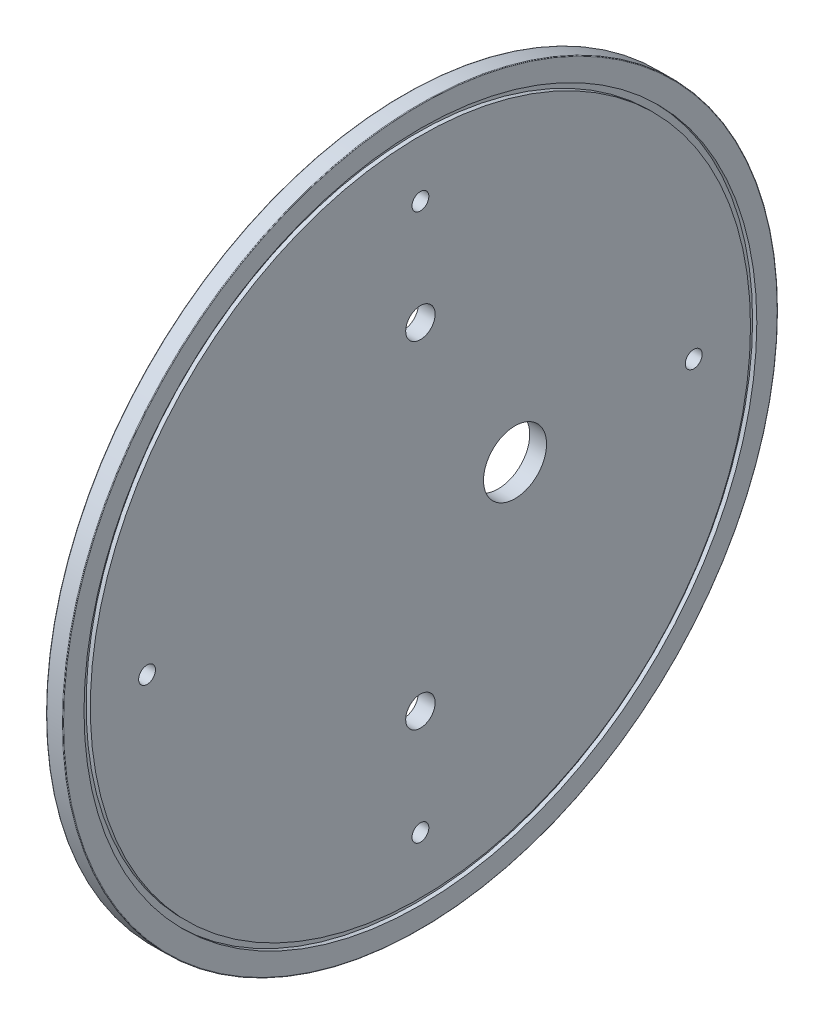
ISO-10303-21;
HEADER;
FILE_DESCRIPTION(('STEP AP214'),'2;1');
FILE_NAME('part.step','',(''),(''),'','','');
FILE_SCHEMA(('AUTOMOTIVE_DESIGN { 1 0 10303 214 1 1 1 1 }'));
ENDSEC;
DATA;
#1=APPLICATION_CONTEXT('core data for automotive mechanical design processes');
#2=APPLICATION_PROTOCOL_DEFINITION('international standard','automotive_design',2000,#1);
#3=PRODUCT_CONTEXT('',#1,'mechanical');
#4=PRODUCT('Part','Part','',(#3));
#5=PRODUCT_RELATED_PRODUCT_CATEGORY('part','',(#4));
#6=PRODUCT_DEFINITION_FORMATION('','',#4);
#7=PRODUCT_DEFINITION_CONTEXT('part definition',#1,'design');
#8=PRODUCT_DEFINITION('design','',#6,#7);
#9=PRODUCT_DEFINITION_SHAPE('','',#8);
#10=(LENGTH_UNIT() NAMED_UNIT(*) SI_UNIT(.MILLI.,.METRE.));
#11=(NAMED_UNIT(*) PLANE_ANGLE_UNIT() SI_UNIT($,.RADIAN.));
#12=(NAMED_UNIT(*) SI_UNIT($,.STERADIAN.) SOLID_ANGLE_UNIT());
#13=UNCERTAINTY_MEASURE_WITH_UNIT(LENGTH_MEASURE(1.E-05),#10,'distance_accuracy_value','');
#14=(GEOMETRIC_REPRESENTATION_CONTEXT(3) GLOBAL_UNCERTAINTY_ASSIGNED_CONTEXT((#13)) GLOBAL_UNIT_ASSIGNED_CONTEXT((#10,
#11,#12)) REPRESENTATION_CONTEXT('',''));
#15=CARTESIAN_POINT('',(0.,0.,0.));
#16=DIRECTION('',(0.,0.,1.));
#17=DIRECTION('',(1.,0.,0.));
#18=AXIS2_PLACEMENT_3D('',#15,#16,#17);
#19=CARTESIAN_POINT('',(8.,0.,0.));
#20=DIRECTION('',(1.,0.,0.));
#21=DIRECTION('',(0.,0.,-1.));
#22=AXIS2_PLACEMENT_3D('',#19,#20,#21);
#23=PLANE('',#22);
#24=CARTESIAN_POINT('',(8.,-80.,0.));
#25=DIRECTION('',(1.,0.,0.));
#26=DIRECTION('',(0.,0.,-1.));
#27=AXIS2_PLACEMENT_3D('',#24,#25,#26);
#28=CIRCLE('',#27,7.);
#29=CARTESIAN_POINT('',(8.,-80.,-7.));
#30=VERTEX_POINT('',#29);
#31=EDGE_CURVE('E113',#30,#30,#28,.T.);
#32=ORIENTED_EDGE('',*,*,#31,.F.);
#33=EDGE_LOOP('',(#32));
#34=FACE_BOUND('',#33,.T.);
#35=CARTESIAN_POINT('',(8.,80.,0.));
#36=DIRECTION('',(1.,0.,0.));
#37=DIRECTION('',(0.,0.,-1.));
#38=AXIS2_PLACEMENT_3D('',#35,#36,#37);
#39=CIRCLE('',#38,7.);
#40=CARTESIAN_POINT('',(8.,80.,-7.));
#41=VERTEX_POINT('',#40);
#42=EDGE_CURVE('E117',#41,#41,#39,.T.);
#43=ORIENTED_EDGE('',*,*,#42,.F.);
#44=EDGE_LOOP('',(#43));
#45=FACE_BOUND('',#44,.T.);
#46=CARTESIAN_POINT('',(8.,0.,-45.));
#47=DIRECTION('',(1.,0.,0.));
#48=DIRECTION('',(0.,0.,-1.));
#49=AXIS2_PLACEMENT_3D('',#46,#47,#48);
#50=CIRCLE('',#49,15.);
#51=CARTESIAN_POINT('',(8.,0.,-60.));
#52=VERTEX_POINT('',#51);
#53=EDGE_CURVE('E109',#52,#52,#50,.T.);
#54=ORIENTED_EDGE('',*,*,#53,.F.);
#55=EDGE_LOOP('',(#54));
#56=FACE_BOUND('',#55,.T.);
#57=CARTESIAN_POINT('',(8.,130.,0.));
#58=DIRECTION('',(1.,0.,0.));
#59=DIRECTION('',(0.,0.,-1.));
#60=AXIS2_PLACEMENT_3D('',#57,#58,#59);
#61=CIRCLE('',#60,4.00000000000001);
#62=CARTESIAN_POINT('',(8.,130.,-4.00000000000001));
#63=VERTEX_POINT('',#62);
#64=EDGE_CURVE('E66',#63,#63,#61,.T.);
#65=ORIENTED_EDGE('',*,*,#64,.F.);
#66=EDGE_LOOP('',(#65));
#67=FACE_BOUND('',#66,.T.);
#68=CARTESIAN_POINT('',(8.,1.36167772214882E-12,-130.));
#69=DIRECTION('',(1.,0.,0.));
#70=DIRECTION('',(0.,-1.,0.));
#71=AXIS2_PLACEMENT_3D('',#68,#69,#70);
#72=CIRCLE('',#71,4.00000000000001);
#73=CARTESIAN_POINT('',(8.,-3.99999999999865,-130.));
#74=VERTEX_POINT('',#73);
#75=EDGE_CURVE('E82',#74,#74,#72,.T.);
#76=ORIENTED_EDGE('',*,*,#75,.F.);
#77=EDGE_LOOP('',(#76));
#78=FACE_BOUND('',#77,.T.);
#79=CARTESIAN_POINT('',(8.,-130.,0.));
#80=DIRECTION('',(1.,0.,0.));
#81=DIRECTION('',(0.,0.,1.));
#82=AXIS2_PLACEMENT_3D('',#79,#80,#81);
#83=CIRCLE('',#82,4.00000000000001);
#84=CARTESIAN_POINT('',(8.,-130.,4.00000000000001));
#85=VERTEX_POINT('',#84);
#86=EDGE_CURVE('E86',#85,#85,#83,.T.);
#87=ORIENTED_EDGE('',*,*,#86,.F.);
#88=EDGE_LOOP('',(#87));
#89=FACE_BOUND('',#88,.T.);
#90=CARTESIAN_POINT('',(8.,-4.53892574049607E-13,130.));
#91=DIRECTION('',(1.,0.,0.));
#92=DIRECTION('',(0.,1.,0.));
#93=AXIS2_PLACEMENT_3D('',#90,#91,#92);
#94=CIRCLE('',#93,4.00000000000001);
#95=CARTESIAN_POINT('',(8.,3.99999999999956,130.));
#96=VERTEX_POINT('',#95);
#97=EDGE_CURVE('E75',#96,#96,#94,.T.);
#98=ORIENTED_EDGE('',*,*,#97,.F.);
#99=EDGE_LOOP('',(#98));
#100=FACE_BOUND('',#99,.T.);
#101=CARTESIAN_POINT('',(8.,0.,0.));
#102=DIRECTION('',(1.,0.,0.));
#103=DIRECTION('',(0.,0.,-1.));
#104=AXIS2_PLACEMENT_3D('',#101,#102,#103);
#105=CIRCLE('',#104,157.);
#106=CARTESIAN_POINT('',(8.,0.,-157.));
#107=VERTEX_POINT('',#106);
#108=EDGE_CURVE('E102',#107,#107,#105,.T.);
#109=ORIENTED_EDGE('',*,*,#108,.T.);
#110=EDGE_LOOP('',(#109));
#111=FACE_BOUND('',#110,.T.);
#112=ADVANCED_FACE('F37',(#34,#45,#56,#67,#78,#89,#100,#111),#23,.T.);
#113=CARTESIAN_POINT('',(8.,0.,0.));
#114=DIRECTION('',(-1.,0.,0.));
#115=DIRECTION('',(0.,0.,1.));
#116=AXIS2_PLACEMENT_3D('',#113,#114,#115);
#117=CYLINDRICAL_SURFACE('',#116,170.);
#118=CARTESIAN_POINT('',(0.3,0.,0.));
#119=DIRECTION('',(1.,0.,0.));
#120=DIRECTION('',(0.,0.,-1.));
#121=AXIS2_PLACEMENT_3D('',#118,#119,#120);
#122=CIRCLE('',#121,170.);
#123=CARTESIAN_POINT('',(0.3,0.,-170.));
#124=VERTEX_POINT('',#123);
#125=EDGE_CURVE('E51',#124,#124,#122,.T.);
#126=ORIENTED_EDGE('',*,*,#125,.T.);
#127=EDGE_LOOP('',(#126));
#128=FACE_BOUND('',#127,.T.);
#129=CARTESIAN_POINT('',(7.7,0.,0.));
#130=DIRECTION('',(1.,0.,0.));
#131=DIRECTION('',(0.,0.,-1.));
#132=AXIS2_PLACEMENT_3D('',#129,#130,#131);
#133=CIRCLE('',#132,170.);
#134=CARTESIAN_POINT('',(7.7,0.,-170.));
#135=VERTEX_POINT('',#134);
#136=EDGE_CURVE('E57',#135,#135,#133,.F.);
#137=ORIENTED_EDGE('',*,*,#136,.T.);
#138=EDGE_LOOP('',(#137));
#139=FACE_BOUND('',#138,.T.);
#140=ADVANCED_FACE('F165',(#128,#139),#117,.T.);
#141=CARTESIAN_POINT('',(8.,0.,0.));
#142=DIRECTION('',(1.,0.,0.));
#143=DIRECTION('',(0.,0.,-1.));
#144=AXIS2_PLACEMENT_3D('',#141,#142,#143);
#145=CIRCLE('',#144,169.7);
#146=CARTESIAN_POINT('',(8.,0.,-169.7));
#147=VERTEX_POINT('',#146);
#148=EDGE_CURVE('E10',#147,#147,#145,.T.);
#149=ORIENTED_EDGE('',*,*,#148,.T.);
#150=EDGE_LOOP('',(#149));
#151=FACE_BOUND('',#150,.T.);
#152=CARTESIAN_POINT('',(8.,0.,0.));
#153=DIRECTION('',(1.,0.,0.));
#154=DIRECTION('',(0.,0.,-1.));
#155=AXIS2_PLACEMENT_3D('',#152,#153,#154);
#156=CIRCLE('',#155,160.);
#157=CARTESIAN_POINT('',(8.,0.,-160.));
#158=VERTEX_POINT('',#157);
#159=EDGE_CURVE('E94',#158,#158,#156,.T.);
#160=ORIENTED_EDGE('',*,*,#159,.F.);
#161=EDGE_LOOP('',(#160));
#162=FACE_BOUND('',#161,.T.);
#163=ADVANCED_FACE('F136',(#151,#162),#23,.T.);
#164=CARTESIAN_POINT('',(0.,0.,0.));
#165=DIRECTION('',(1.,0.,0.));
#166=DIRECTION('',(0.,0.,-1.));
#167=AXIS2_PLACEMENT_3D('',#164,#165,#166);
#168=PLANE('',#167);
#169=CARTESIAN_POINT('',(0.,-80.,0.));
#170=DIRECTION('',(-1.,0.,0.));
#171=DIRECTION('',(0.,0.,1.));
#172=AXIS2_PLACEMENT_3D('',#169,#170,#171);
#173=CIRCLE('',#172,7.);
#174=CARTESIAN_POINT('',(0.,-80.,7.));
#175=VERTEX_POINT('',#174);
#176=EDGE_CURVE('E121',#175,#175,#173,.T.);
#177=ORIENTED_EDGE('',*,*,#176,.F.);
#178=EDGE_LOOP('',(#177));
#179=FACE_BOUND('',#178,.T.);
#180=CARTESIAN_POINT('',(0.,80.,0.));
#181=DIRECTION('',(-1.,0.,0.));
#182=DIRECTION('',(0.,0.,1.));
#183=AXIS2_PLACEMENT_3D('',#180,#181,#182);
#184=CIRCLE('',#183,7.);
#185=CARTESIAN_POINT('',(0.,80.,7.));
#186=VERTEX_POINT('',#185);
#187=EDGE_CURVE('E122',#186,#186,#184,.T.);
#188=ORIENTED_EDGE('',*,*,#187,.F.);
#189=EDGE_LOOP('',(#188));
#190=FACE_BOUND('',#189,.T.);
#191=CARTESIAN_POINT('',(0.,0.,-45.));
#192=DIRECTION('',(1.,0.,0.));
#193=DIRECTION('',(0.,0.,-1.));
#194=AXIS2_PLACEMENT_3D('',#191,#192,#193);
#195=CIRCLE('',#194,15.);
#196=CARTESIAN_POINT('',(0.,0.,-60.));
#197=VERTEX_POINT('',#196);
#198=EDGE_CURVE('E41',#197,#197,#195,.T.);
#199=ORIENTED_EDGE('',*,*,#198,.T.);
#200=EDGE_LOOP('',(#199));
#201=FACE_BOUND('',#200,.T.);
#202=CARTESIAN_POINT('',(0.,0.,0.));
#203=DIRECTION('',(1.,0.,0.));
#204=DIRECTION('',(0.,0.,-1.));
#205=AXIS2_PLACEMENT_3D('',#202,#203,#204);
#206=CIRCLE('',#205,169.7);
#207=CARTESIAN_POINT('',(0.,0.,-169.7));
#208=VERTEX_POINT('',#207);
#209=EDGE_CURVE('E46',#208,#208,#206,.F.);
#210=ORIENTED_EDGE('',*,*,#209,.T.);
#211=EDGE_LOOP('',(#210));
#212=FACE_BOUND('',#211,.T.);
#213=CARTESIAN_POINT('',(0.,-4.53892574049607E-13,130.));
#214=DIRECTION('',(1.,0.,0.));
#215=DIRECTION('',(0.,0.,-1.));
#216=AXIS2_PLACEMENT_3D('',#213,#214,#215);
#217=CIRCLE('',#216,4.00000000000001);
#218=CARTESIAN_POINT('',(0.,-4.53892574049607E-13,126.));
#219=VERTEX_POINT('',#218);
#220=EDGE_CURVE('E62',#219,#219,#217,.T.);
#221=ORIENTED_EDGE('',*,*,#220,.T.);
#222=EDGE_LOOP('',(#221));
#223=FACE_BOUND('',#222,.T.);
#224=CARTESIAN_POINT('',(0.,-130.,0.));
#225=DIRECTION('',(1.,0.,0.));
#226=DIRECTION('',(0.,0.,-1.));
#227=AXIS2_PLACEMENT_3D('',#224,#225,#226);
#228=CIRCLE('',#227,4.00000000000001);
#229=CARTESIAN_POINT('',(0.,-130.,-4.00000000000001));
#230=VERTEX_POINT('',#229);
#231=EDGE_CURVE('E67',#230,#230,#228,.T.);
#232=ORIENTED_EDGE('',*,*,#231,.T.);
#233=EDGE_LOOP('',(#232));
#234=FACE_BOUND('',#233,.T.);
#235=CARTESIAN_POINT('',(0.,1.36167772214882E-12,-130.));
#236=DIRECTION('',(1.,0.,0.));
#237=DIRECTION('',(0.,0.,-1.));
#238=AXIS2_PLACEMENT_3D('',#235,#236,#237);
#239=CIRCLE('',#238,4.00000000000001);
#240=CARTESIAN_POINT('',(0.,1.36167772214882E-12,-134.));
#241=VERTEX_POINT('',#240);
#242=EDGE_CURVE('E71',#241,#241,#239,.T.);
#243=ORIENTED_EDGE('',*,*,#242,.T.);
#244=EDGE_LOOP('',(#243));
#245=FACE_BOUND('',#244,.T.);
#246=CARTESIAN_POINT('',(0.,130.,0.));
#247=DIRECTION('',(1.,0.,0.));
#248=DIRECTION('',(0.,0.,-1.));
#249=AXIS2_PLACEMENT_3D('',#246,#247,#248);
#250=CIRCLE('',#249,4.00000000000001);
#251=CARTESIAN_POINT('',(0.,130.,-4.00000000000001));
#252=VERTEX_POINT('',#251);
#253=EDGE_CURVE('E61',#252,#252,#250,.T.);
#254=ORIENTED_EDGE('',*,*,#253,.T.);
#255=EDGE_LOOP('',(#254));
#256=FACE_BOUND('',#255,.T.);
#257=ADVANCED_FACE('F132',(#179,#190,#201,#212,#223,#234,#245,#256),#168,.F.);
#258=CARTESIAN_POINT('',(-2.,130.,0.));
#259=DIRECTION('',(1.,0.,0.));
#260=DIRECTION('',(0.,0.,-1.));
#261=AXIS2_PLACEMENT_3D('',#258,#259,#260);
#262=CYLINDRICAL_SURFACE('',#261,4.00000000000001);
#263=ORIENTED_EDGE('',*,*,#64,.T.);
#264=EDGE_LOOP('',(#263));
#265=FACE_BOUND('',#264,.T.);
#266=ORIENTED_EDGE('',*,*,#253,.F.);
#267=EDGE_LOOP('',(#266));
#268=FACE_BOUND('',#267,.T.);
#269=ADVANCED_FACE('F135',(#265,#268),#262,.F.);
#270=CARTESIAN_POINT('',(-2.,1.36167772214882E-12,-130.));
#271=DIRECTION('',(1.,0.,0.));
#272=DIRECTION('',(0.,0.,-1.));
#273=AXIS2_PLACEMENT_3D('',#270,#271,#272);
#274=CYLINDRICAL_SURFACE('',#273,4.00000000000001);
#275=ORIENTED_EDGE('',*,*,#75,.T.);
#276=EDGE_LOOP('',(#275));
#277=FACE_BOUND('',#276,.T.);
#278=ORIENTED_EDGE('',*,*,#242,.F.);
#279=EDGE_LOOP('',(#278));
#280=FACE_BOUND('',#279,.T.);
#281=ADVANCED_FACE('F154',(#277,#280),#274,.F.);
#282=CARTESIAN_POINT('',(-2.,-130.,0.));
#283=DIRECTION('',(1.,0.,0.));
#284=DIRECTION('',(0.,0.,-1.));
#285=AXIS2_PLACEMENT_3D('',#282,#283,#284);
#286=CYLINDRICAL_SURFACE('',#285,4.00000000000001);
#287=ORIENTED_EDGE('',*,*,#86,.T.);
#288=EDGE_LOOP('',(#287));
#289=FACE_BOUND('',#288,.T.);
#290=ORIENTED_EDGE('',*,*,#231,.F.);
#291=EDGE_LOOP('',(#290));
#292=FACE_BOUND('',#291,.T.);
#293=ADVANCED_FACE('F160',(#289,#292),#286,.F.);
#294=CARTESIAN_POINT('',(-2.,-4.53892574049607E-13,130.));
#295=DIRECTION('',(1.,0.,0.));
#296=DIRECTION('',(0.,0.,-1.));
#297=AXIS2_PLACEMENT_3D('',#294,#295,#296);
#298=CYLINDRICAL_SURFACE('',#297,4.00000000000001);
#299=ORIENTED_EDGE('',*,*,#97,.T.);
#300=EDGE_LOOP('',(#299));
#301=FACE_BOUND('',#300,.T.);
#302=ORIENTED_EDGE('',*,*,#220,.F.);
#303=EDGE_LOOP('',(#302));
#304=FACE_BOUND('',#303,.T.);
#305=ADVANCED_FACE('F183',(#301,#304),#298,.F.);
#306=CARTESIAN_POINT('',(6.,0.,0.));
#307=DIRECTION('',(1.,0.,0.));
#308=DIRECTION('',(0.,0.,-1.));
#309=AXIS2_PLACEMENT_3D('',#306,#307,#308);
#310=CYLINDRICAL_SURFACE('',#309,160.);
#311=CARTESIAN_POINT('',(6.,0.,0.));
#312=DIRECTION('',(1.,0.,0.));
#313=DIRECTION('',(0.,0.,-1.));
#314=AXIS2_PLACEMENT_3D('',#311,#312,#313);
#315=CIRCLE('',#314,160.);
#316=CARTESIAN_POINT('',(6.,0.,-160.));
#317=VERTEX_POINT('',#316);
#318=EDGE_CURVE('E87',#317,#317,#315,.T.);
#319=ORIENTED_EDGE('',*,*,#318,.F.);
#320=EDGE_LOOP('',(#319));
#321=FACE_BOUND('',#320,.T.);
#322=ORIENTED_EDGE('',*,*,#159,.T.);
#323=EDGE_LOOP('',(#322));
#324=FACE_BOUND('',#323,.T.);
#325=ADVANCED_FACE('F180',(#321,#324),#310,.F.);
#326=CARTESIAN_POINT('',(6.,0.,0.));
#327=DIRECTION('',(1.,0.,0.));
#328=DIRECTION('',(0.,0.,-1.));
#329=AXIS2_PLACEMENT_3D('',#326,#327,#328);
#330=PLANE('',#329);
#331=CARTESIAN_POINT('',(6.,0.,0.));
#332=DIRECTION('',(1.,0.,0.));
#333=DIRECTION('',(0.,0.,-1.));
#334=AXIS2_PLACEMENT_3D('',#331,#332,#333);
#335=CIRCLE('',#334,157.);
#336=CARTESIAN_POINT('',(6.,0.,-157.));
#337=VERTEX_POINT('',#336);
#338=EDGE_CURVE('E98',#337,#337,#335,.T.);
#339=ORIENTED_EDGE('',*,*,#338,.F.);
#340=EDGE_LOOP('',(#339));
#341=FACE_BOUND('',#340,.T.);
#342=ORIENTED_EDGE('',*,*,#318,.T.);
#343=EDGE_LOOP('',(#342));
#344=FACE_BOUND('',#343,.T.);
#345=ADVANCED_FACE('F182',(#341,#344),#330,.T.);
#346=CARTESIAN_POINT('',(6.,0.,0.));
#347=DIRECTION('',(1.,0.,0.));
#348=DIRECTION('',(0.,0.,-1.));
#349=AXIS2_PLACEMENT_3D('',#346,#347,#348);
#350=CYLINDRICAL_SURFACE('',#349,157.);
#351=ORIENTED_EDGE('',*,*,#338,.T.);
#352=EDGE_LOOP('',(#351));
#353=FACE_BOUND('',#352,.T.);
#354=ORIENTED_EDGE('',*,*,#108,.F.);
#355=EDGE_LOOP('',(#354));
#356=FACE_BOUND('',#355,.T.);
#357=ADVANCED_FACE('F190',(#353,#356),#350,.T.);
#358=CARTESIAN_POINT('',(0.3,0.,0.));
#359=DIRECTION('',(1.,0.,0.));
#360=DIRECTION('',(0.,0.,-1.));
#361=AXIS2_PLACEMENT_3D('',#358,#359,#360);
#362=TOROIDAL_SURFACE('',#361,169.7,0.3);
#363=ORIENTED_EDGE('',*,*,#209,.F.);
#364=EDGE_LOOP('',(#363));
#365=FACE_BOUND('',#364,.T.);
#366=ORIENTED_EDGE('',*,*,#125,.F.);
#367=EDGE_LOOP('',(#366));
#368=FACE_BOUND('',#367,.T.);
#369=ADVANCED_FACE('F211',(#365,#368),#362,.T.);
#370=CARTESIAN_POINT('',(7.7,0.,0.));
#371=DIRECTION('',(1.,0.,0.));
#372=DIRECTION('',(0.,0.,-1.));
#373=AXIS2_PLACEMENT_3D('',#370,#371,#372);
#374=TOROIDAL_SURFACE('',#373,169.7,0.3);
#375=ORIENTED_EDGE('',*,*,#136,.F.);
#376=EDGE_LOOP('',(#375));
#377=FACE_BOUND('',#376,.T.);
#378=ORIENTED_EDGE('',*,*,#148,.F.);
#379=EDGE_LOOP('',(#378));
#380=FACE_BOUND('',#379,.T.);
#381=ADVANCED_FACE('F39',(#377,#380),#374,.T.);
#382=CARTESIAN_POINT('',(-2.,0.,-45.));
#383=DIRECTION('',(1.,0.,0.));
#384=DIRECTION('',(0.,0.,-1.));
#385=AXIS2_PLACEMENT_3D('',#382,#383,#384);
#386=CYLINDRICAL_SURFACE('',#385,15.);
#387=ORIENTED_EDGE('',*,*,#53,.T.);
#388=EDGE_LOOP('',(#387));
#389=FACE_BOUND('',#388,.T.);
#390=ORIENTED_EDGE('',*,*,#198,.F.);
#391=EDGE_LOOP('',(#390));
#392=FACE_BOUND('',#391,.T.);
#393=ADVANCED_FACE('F218',(#389,#392),#386,.F.);
#394=CARTESIAN_POINT('',(10.,80.,0.));
#395=DIRECTION('',(-1.,0.,0.));
#396=DIRECTION('',(0.,0.,1.));
#397=AXIS2_PLACEMENT_3D('',#394,#395,#396);
#398=CYLINDRICAL_SURFACE('',#397,7.);
#399=ORIENTED_EDGE('',*,*,#42,.T.);
#400=EDGE_LOOP('',(#399));
#401=FACE_BOUND('',#400,.T.);
#402=ORIENTED_EDGE('',*,*,#187,.T.);
#403=EDGE_LOOP('',(#402));
#404=FACE_BOUND('',#403,.T.);
#405=ADVANCED_FACE('F221',(#401,#404),#398,.F.);
#406=CARTESIAN_POINT('',(10.,-80.,0.));
#407=DIRECTION('',(-1.,0.,0.));
#408=DIRECTION('',(0.,0.,1.));
#409=AXIS2_PLACEMENT_3D('',#406,#407,#408);
#410=CYLINDRICAL_SURFACE('',#409,7.);
#411=ORIENTED_EDGE('',*,*,#31,.T.);
#412=EDGE_LOOP('',(#411));
#413=FACE_BOUND('',#412,.T.);
#414=ORIENTED_EDGE('',*,*,#176,.T.);
#415=EDGE_LOOP('',(#414));
#416=FACE_BOUND('',#415,.T.);
#417=ADVANCED_FACE('F130',(#413,#416),#410,.F.);
#418=CLOSED_SHELL('',(#112,#140,#163,#257,#269,#281,#293,#305,#325,#345,#357,#369,#381,#393,
#405,#417));
#419=MANIFOLD_SOLID_BREP('B2',#418);
#420=ADVANCED_BREP_SHAPE_REPRESENTATION('',(#18,#419),#14);
#421=SHAPE_DEFINITION_REPRESENTATION(#9,#420);
ENDSEC;
END-ISO-10303-21;
